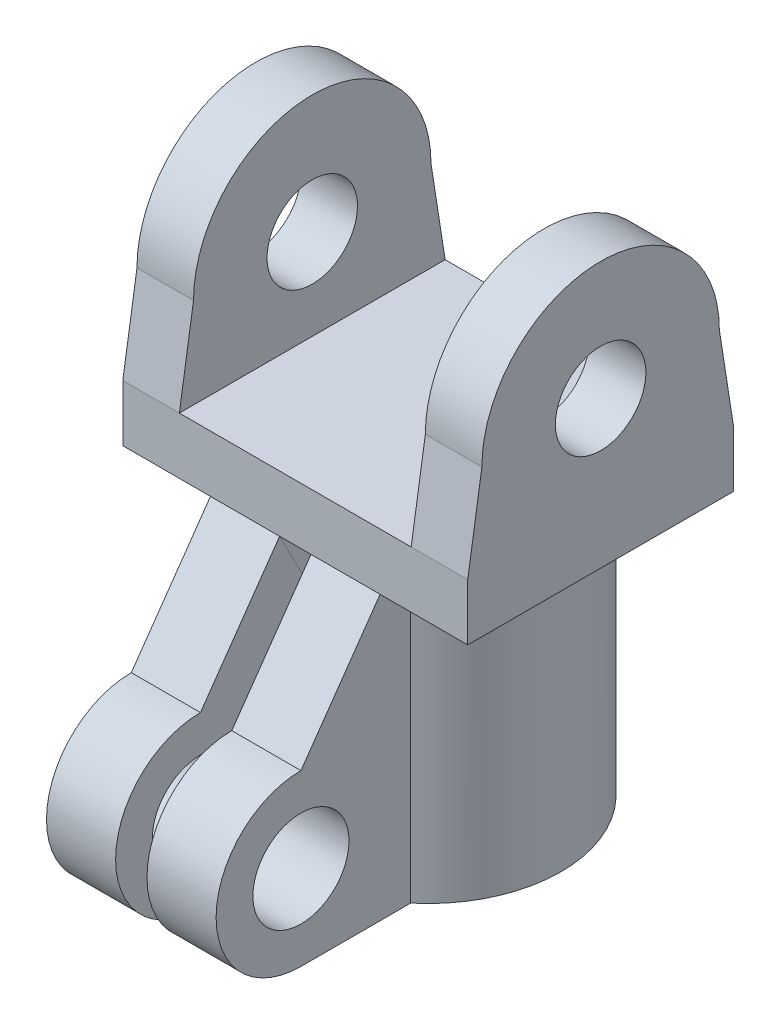
ISO-10303-21;
HEADER;
FILE_DESCRIPTION(('STEP AP214'),'2;1');
FILE_NAME('part.step','',(''),(''),'','','');
FILE_SCHEMA(('AUTOMOTIVE_DESIGN { 1 0 10303 214 1 1 1 1 }'));
ENDSEC;
DATA;
#1=APPLICATION_CONTEXT('core data for automotive mechanical design processes');
#2=APPLICATION_PROTOCOL_DEFINITION('international standard','automotive_design',2000,#1);
#3=PRODUCT_CONTEXT('',#1,'mechanical');
#4=PRODUCT('Part','Part','',(#3));
#5=PRODUCT_RELATED_PRODUCT_CATEGORY('part','',(#4));
#6=PRODUCT_DEFINITION_FORMATION('','',#4);
#7=PRODUCT_DEFINITION_CONTEXT('part definition',#1,'design');
#8=PRODUCT_DEFINITION('design','',#6,#7);
#9=PRODUCT_DEFINITION_SHAPE('','',#8);
#10=(LENGTH_UNIT() NAMED_UNIT(*) SI_UNIT(.MILLI.,.METRE.));
#11=(NAMED_UNIT(*) PLANE_ANGLE_UNIT() SI_UNIT($,.RADIAN.));
#12=(NAMED_UNIT(*) SI_UNIT($,.STERADIAN.) SOLID_ANGLE_UNIT());
#13=UNCERTAINTY_MEASURE_WITH_UNIT(LENGTH_MEASURE(1.E-05),#10,'distance_accuracy_value','');
#14=(GEOMETRIC_REPRESENTATION_CONTEXT(3) GLOBAL_UNCERTAINTY_ASSIGNED_CONTEXT((#13)) GLOBAL_UNIT_ASSIGNED_CONTEXT((#10,
#11,#12)) REPRESENTATION_CONTEXT('',''));
#15=CARTESIAN_POINT('',(0.,0.,0.));
#16=DIRECTION('',(0.,0.,1.));
#17=DIRECTION('',(1.,0.,0.));
#18=AXIS2_PLACEMENT_3D('',#15,#16,#17);
#19=CARTESIAN_POINT('',(-3.,3.,7.5));
#20=DIRECTION('',(1.,0.,0.));
#21=DIRECTION('',(0.,0.,-1.));
#22=AXIS2_PLACEMENT_3D('',#19,#20,#21);
#23=CYLINDRICAL_SURFACE('',#22,3.);
#24=DIRECTION('',(1.,0.,0.));
#25=VECTOR('',#24,1.);
#26=CARTESIAN_POINT('',(-3.,0.,7.5));
#27=LINE('',#26,#25);
#28=CARTESIAN_POINT('',(-3.,0.,7.5));
#29=VERTEX_POINT('',#28);
#30=CARTESIAN_POINT('',(-0.554698457996553,0.,7.5));
#31=VERTEX_POINT('',#30);
#32=EDGE_CURVE('E143',#29,#31,#27,.T.);
#33=ORIENTED_EDGE('',*,*,#32,.T.);
#34=CARTESIAN_POINT('',(-0.554698457996553,3.,7.5));
#35=DIRECTION('',(1.,0.,0.));
#36=DIRECTION('',(0.,0.,-1.));
#37=AXIS2_PLACEMENT_3D('',#34,#35,#36);
#38=CIRCLE('',#37,3.);
#39=CARTESIAN_POINT('',(-0.554698457996553,6.,7.5));
#40=VERTEX_POINT('',#39);
#41=EDGE_CURVE('E69',#31,#40,#38,.F.);
#42=ORIENTED_EDGE('',*,*,#41,.T.);
#43=DIRECTION('',(1.,0.,0.));
#44=VECTOR('',#43,1.);
#45=CARTESIAN_POINT('',(-3.,6.,7.5));
#46=LINE('',#45,#44);
#47=CARTESIAN_POINT('',(-3.,6.,7.5));
#48=VERTEX_POINT('',#47);
#49=EDGE_CURVE('E126',#48,#40,#46,.T.);
#50=ORIENTED_EDGE('',*,*,#49,.F.);
#51=CARTESIAN_POINT('',(-3.,3.,7.5));
#52=DIRECTION('',(1.,0.,0.));
#53=DIRECTION('',(0.,0.,-1.));
#54=AXIS2_PLACEMENT_3D('',#51,#52,#53);
#55=CIRCLE('',#54,3.);
#56=EDGE_CURVE('E166',#48,#29,#55,.T.);
#57=ORIENTED_EDGE('',*,*,#56,.T.);
#58=EDGE_LOOP('',(#33,#42,#50,#57));
#59=FACE_BOUND('',#58,.T.);
#60=ADVANCED_FACE('F50',(#59),#23,.T.);
#61=CARTESIAN_POINT('',(-3.,6.,7.5));
#62=DIRECTION('',(0.,0.573462344363329,0.81923192051904));
#63=DIRECTION('',(0.,-0.81923192051904,0.573462344363329));
#64=AXIS2_PLACEMENT_3D('',#61,#62,#63);
#65=PLANE('',#64);
#66=ORIENTED_EDGE('',*,*,#49,.T.);
#67=DIRECTION('',(0.,0.81923192051904,-0.573462344363329));
#68=VECTOR('',#67,1.);
#69=CARTESIAN_POINT('',(-0.554698457996553,6.,7.5));
#70=LINE('',#69,#68);
#71=CARTESIAN_POINT('',(-0.554698457996553,10.,4.7));
#72=VERTEX_POINT('',#71);
#73=EDGE_CURVE('E113',#40,#72,#70,.T.);
#74=ORIENTED_EDGE('',*,*,#73,.T.);
#75=DIRECTION('',(1.,0.,0.));
#76=VECTOR('',#75,1.);
#77=CARTESIAN_POINT('',(-3.,10.,4.7));
#78=LINE('',#77,#76);
#79=CARTESIAN_POINT('',(-3.,10.,4.7));
#80=VERTEX_POINT('',#79);
#81=EDGE_CURVE('E120',#80,#72,#78,.T.);
#82=ORIENTED_EDGE('',*,*,#81,.F.);
#83=DIRECTION('',(0.,-0.81923192051904,0.573462344363329));
#84=VECTOR('',#83,1.);
#85=CARTESIAN_POINT('',(-3.,6.,7.5));
#86=LINE('',#85,#84);
#87=EDGE_CURVE('E127',#80,#48,#86,.T.);
#88=ORIENTED_EDGE('',*,*,#87,.T.);
#89=EDGE_LOOP('',(#66,#74,#82,#88));
#90=FACE_BOUND('',#89,.T.);
#91=ADVANCED_FACE('F123',(#90),#65,.T.);
#92=CARTESIAN_POINT('',(-3.,10.,4.7));
#93=DIRECTION('',(0.,1.,0.));
#94=DIRECTION('',(0.,0.,1.));
#95=AXIS2_PLACEMENT_3D('',#92,#93,#94);
#96=PLANE('',#95);
#97=ORIENTED_EDGE('',*,*,#81,.T.);
#98=DIRECTION('',(0.,0.,-1.));
#99=VECTOR('',#98,1.);
#100=CARTESIAN_POINT('',(-0.554698457996553,10.,10.5));
#101=LINE('',#100,#99);
#102=CARTESIAN_POINT('',(-0.554698457996553,10.,0.));
#103=VERTEX_POINT('',#102);
#104=EDGE_CURVE('E109',#72,#103,#101,.T.);
#105=ORIENTED_EDGE('',*,*,#104,.T.);
#106=DIRECTION('',(1.,0.,0.));
#107=VECTOR('',#106,1.);
#108=CARTESIAN_POINT('',(-3.,10.,0.));
#109=LINE('',#108,#107);
#110=CARTESIAN_POINT('',(-3.,10.,0.));
#111=VERTEX_POINT('',#110);
#112=EDGE_CURVE('E137',#111,#103,#109,.T.);
#113=ORIENTED_EDGE('',*,*,#112,.F.);
#114=DIRECTION('',(0.,0.,1.));
#115=VECTOR('',#114,1.);
#116=CARTESIAN_POINT('',(-3.,10.,4.7));
#117=LINE('',#116,#115);
#118=EDGE_CURVE('E119',#111,#80,#117,.T.);
#119=ORIENTED_EDGE('',*,*,#118,.T.);
#120=EDGE_LOOP('',(#97,#105,#113,#119));
#121=FACE_BOUND('',#120,.T.);
#122=ADVANCED_FACE('F129',(#121),#96,.T.);
#123=CARTESIAN_POINT('',(-3.,10.,0.));
#124=DIRECTION('',(0.,0.,-1.));
#125=DIRECTION('',(-1.,0.,0.));
#126=AXIS2_PLACEMENT_3D('',#123,#124,#125);
#127=PLANE('',#126);
#128=ORIENTED_EDGE('',*,*,#112,.T.);
#129=DIRECTION('',(0.,-1.,0.));
#130=VECTOR('',#129,1.);
#131=CARTESIAN_POINT('',(-0.554698457996553,10.,0.));
#132=LINE('',#131,#130);
#133=CARTESIAN_POINT('',(-0.554698457996553,6.,0.));
#134=VERTEX_POINT('',#133);
#135=EDGE_CURVE('E115',#103,#134,#132,.T.);
#136=ORIENTED_EDGE('',*,*,#135,.T.);
#137=DIRECTION('',(-1.,0.,0.));
#138=VECTOR('',#137,1.);
#139=CARTESIAN_POINT('',(-3.,6.,0.));
#140=LINE('',#139,#138);
#141=CARTESIAN_POINT('',(-2.7,6.,0.));
#142=VERTEX_POINT('',#141);
#143=EDGE_CURVE('E163',#134,#142,#140,.T.);
#144=ORIENTED_EDGE('',*,*,#143,.T.);
#145=DIRECTION('',(0.,-1.,0.));
#146=VECTOR('',#145,1.);
#147=CARTESIAN_POINT('',(-2.7,6.,0.));
#148=LINE('',#147,#146);
#149=CARTESIAN_POINT('',(-2.7,0.,0.));
#150=VERTEX_POINT('',#149);
#151=EDGE_CURVE('E155',#150,#142,#148,.F.);
#152=ORIENTED_EDGE('',*,*,#151,.F.);
#153=DIRECTION('',(1.,0.,0.));
#154=VECTOR('',#153,1.);
#155=CARTESIAN_POINT('',(-3.,0.,0.));
#156=LINE('',#155,#154);
#157=CARTESIAN_POINT('',(-3.,0.,0.));
#158=VERTEX_POINT('',#157);
#159=EDGE_CURVE('E139',#158,#150,#156,.T.);
#160=ORIENTED_EDGE('',*,*,#159,.F.);
#161=DIRECTION('',(0.,1.,0.));
#162=VECTOR('',#161,1.);
#163=CARTESIAN_POINT('',(-3.,10.,0.));
#164=LINE('',#163,#162);
#165=EDGE_CURVE('E160',#158,#111,#164,.T.);
#166=ORIENTED_EDGE('',*,*,#165,.T.);
#167=EDGE_LOOP('',(#128,#136,#144,#152,#160,#166));
#168=FACE_BOUND('',#167,.T.);
#169=ADVANCED_FACE('F174',(#168),#127,.T.);
#170=CARTESIAN_POINT('',(-3.,0.,0.));
#171=DIRECTION('',(0.,-1.,0.));
#172=DIRECTION('',(0.,0.,-1.));
#173=AXIS2_PLACEMENT_3D('',#170,#171,#172);
#174=PLANE('',#173);
#175=CARTESIAN_POINT('',(0.,0.,0.));
#176=DIRECTION('',(0.,-1.,0.));
#177=DIRECTION('',(0.,0.,-1.));
#178=AXIS2_PLACEMENT_3D('',#175,#176,#177);
#179=CIRCLE('',#178,2.7);
#180=CARTESIAN_POINT('',(-0.554698457996553,0.,2.64240602873522));
#181=VERTEX_POINT('',#180);
#182=EDGE_CURVE('E54',#181,#150,#179,.T.);
#183=ORIENTED_EDGE('',*,*,#182,.F.);
#184=DIRECTION('',(0.,0.,-1.));
#185=VECTOR('',#184,1.);
#186=CARTESIAN_POINT('',(-0.554698457996553,0.,10.5));
#187=LINE('',#186,#185);
#188=EDGE_CURVE('E153',#31,#181,#187,.T.);
#189=ORIENTED_EDGE('',*,*,#188,.F.);
#190=ORIENTED_EDGE('',*,*,#32,.F.);
#191=DIRECTION('',(0.,0.,-1.));
#192=VECTOR('',#191,1.);
#193=CARTESIAN_POINT('',(-3.,0.,0.));
#194=LINE('',#193,#192);
#195=EDGE_CURVE('E142',#29,#158,#194,.T.);
#196=ORIENTED_EDGE('',*,*,#195,.T.);
#197=ORIENTED_EDGE('',*,*,#159,.T.);
#198=EDGE_LOOP('',(#183,#189,#190,#196,#197));
#199=FACE_BOUND('',#198,.T.);
#200=ADVANCED_FACE('F200',(#199),#174,.T.);
#201=CARTESIAN_POINT('',(-3.,3.,7.5));
#202=DIRECTION('',(1.,0.,0.));
#203=DIRECTION('',(0.,0.,-1.));
#204=AXIS2_PLACEMENT_3D('',#201,#202,#203);
#205=CYLINDRICAL_SURFACE('',#204,1.7);
#206=CARTESIAN_POINT('',(-3.,3.,7.5));
#207=DIRECTION('',(1.,0.,0.));
#208=DIRECTION('',(0.,0.,-1.));
#209=AXIS2_PLACEMENT_3D('',#206,#207,#208);
#210=CIRCLE('',#209,1.7);
#211=CARTESIAN_POINT('',(-3.,3.,5.8));
#212=VERTEX_POINT('',#211);
#213=EDGE_CURVE('E147',#212,#212,#210,.T.);
#214=ORIENTED_EDGE('',*,*,#213,.F.);
#215=EDGE_LOOP('',(#214));
#216=FACE_BOUND('',#215,.T.);
#217=CARTESIAN_POINT('',(-0.554698457996553,3.,7.5));
#218=DIRECTION('',(1.,0.,0.));
#219=DIRECTION('',(0.,0.,-1.));
#220=AXIS2_PLACEMENT_3D('',#217,#218,#219);
#221=CIRCLE('',#220,1.7);
#222=CARTESIAN_POINT('',(-0.554698457996553,3.,5.8));
#223=VERTEX_POINT('',#222);
#224=EDGE_CURVE('E12',#223,#223,#221,.F.);
#225=ORIENTED_EDGE('',*,*,#224,.F.);
#226=EDGE_LOOP('',(#225));
#227=FACE_BOUND('',#226,.T.);
#228=ADVANCED_FACE('F52',(#216,#227),#205,.F.);
#229=CARTESIAN_POINT('',(0.,6.,0.));
#230=DIRECTION('',(0.,-1.,0.));
#231=DIRECTION('',(0.,0.,-1.));
#232=AXIS2_PLACEMENT_3D('',#229,#230,#231);
#233=CYLINDRICAL_SURFACE('',#232,2.7);
#234=DIRECTION('',(0.,-1.,0.));
#235=VECTOR('',#234,1.);
#236=CARTESIAN_POINT('',(-0.554698457996553,6.,2.64240602873522));
#237=LINE('',#236,#235);
#238=CARTESIAN_POINT('',(-0.554698457996553,6.,2.64240602873522));
#239=VERTEX_POINT('',#238);
#240=EDGE_CURVE('E60',#181,#239,#237,.F.);
#241=ORIENTED_EDGE('',*,*,#240,.F.);
#242=ORIENTED_EDGE('',*,*,#182,.T.);
#243=ORIENTED_EDGE('',*,*,#151,.T.);
#244=CARTESIAN_POINT('',(0.,6.,0.));
#245=DIRECTION('',(0.,-1.,0.));
#246=DIRECTION('',(0.,0.,-1.));
#247=AXIS2_PLACEMENT_3D('',#244,#245,#246);
#248=CIRCLE('',#247,2.7);
#249=EDGE_CURVE('E145',#239,#142,#248,.T.);
#250=ORIENTED_EDGE('',*,*,#249,.F.);
#251=EDGE_LOOP('',(#241,#242,#243,#250));
#252=FACE_BOUND('',#251,.T.);
#253=ADVANCED_FACE('F178',(#252),#233,.F.);
#254=CARTESIAN_POINT('',(0.,6.,0.));
#255=DIRECTION('',(0.,-1.,0.));
#256=DIRECTION('',(0.,0.,-1.));
#257=AXIS2_PLACEMENT_3D('',#254,#255,#256);
#258=PLANE('',#257);
#259=ORIENTED_EDGE('',*,*,#143,.F.);
#260=DIRECTION('',(0.,0.,1.));
#261=VECTOR('',#260,1.);
#262=CARTESIAN_POINT('',(-0.554698457996553,6.,0.));
#263=LINE('',#262,#261);
#264=EDGE_CURVE('E82',#134,#239,#263,.T.);
#265=ORIENTED_EDGE('',*,*,#264,.T.);
#266=ORIENTED_EDGE('',*,*,#249,.T.);
#267=EDGE_LOOP('',(#259,#265,#266));
#268=FACE_BOUND('',#267,.T.);
#269=ADVANCED_FACE('F175',(#268),#258,.T.);
#270=CARTESIAN_POINT('',(-3.,3.,7.5));
#271=DIRECTION('',(1.,0.,0.));
#272=DIRECTION('',(0.,0.,-1.));
#273=AXIS2_PLACEMENT_3D('',#270,#271,#272);
#274=PLANE('',#273);
#275=ORIENTED_EDGE('',*,*,#213,.T.);
#276=EDGE_LOOP('',(#275));
#277=FACE_BOUND('',#276,.T.);
#278=ORIENTED_EDGE('',*,*,#56,.F.);
#279=ORIENTED_EDGE('',*,*,#87,.F.);
#280=ORIENTED_EDGE('',*,*,#118,.F.);
#281=ORIENTED_EDGE('',*,*,#165,.F.);
#282=ORIENTED_EDGE('',*,*,#195,.F.);
#283=EDGE_LOOP('',(#278,#279,#280,#281,#282));
#284=FACE_BOUND('',#283,.T.);
#285=ADVANCED_FACE('F177',(#277,#284),#274,.F.);
#286=CARTESIAN_POINT('',(-0.554698457996553,10.,10.5));
#287=DIRECTION('',(1.,0.,0.));
#288=DIRECTION('',(0.,0.,-1.));
#289=AXIS2_PLACEMENT_3D('',#286,#287,#288);
#290=PLANE('',#289);
#291=ORIENTED_EDGE('',*,*,#188,.T.);
#292=ORIENTED_EDGE('',*,*,#240,.T.);
#293=ORIENTED_EDGE('',*,*,#264,.F.);
#294=ORIENTED_EDGE('',*,*,#135,.F.);
#295=ORIENTED_EDGE('',*,*,#104,.F.);
#296=ORIENTED_EDGE('',*,*,#73,.F.);
#297=ORIENTED_EDGE('',*,*,#41,.F.);
#298=EDGE_LOOP('',(#291,#292,#293,#294,#295,#296,#297));
#299=FACE_BOUND('',#298,.T.);
#300=ORIENTED_EDGE('',*,*,#224,.T.);
#301=EDGE_LOOP('',(#300));
#302=FACE_BOUND('',#301,.T.);
#303=ADVANCED_FACE('F111',(#299,#302),#290,.T.);
#304=CLOSED_SHELL('',(#60,#91,#122,#169,#200,#228,#253,#269,#285,#303));
#305=MANIFOLD_SOLID_BREP('B2',#304);
#306=CARTESIAN_POINT('',(0.,6.,0.));
#307=DIRECTION('',(0.,-1.,0.));
#308=DIRECTION('',(0.,0.,-1.));
#309=AXIS2_PLACEMENT_3D('',#306,#307,#308);
#310=PLANE('',#309);
#311=CARTESIAN_POINT('',(0.,6.,0.));
#312=DIRECTION('',(0.,-1.,0.));
#313=DIRECTION('',(0.,0.,-1.));
#314=AXIS2_PLACEMENT_3D('',#311,#312,#313);
#315=CIRCLE('',#314,2.7);
#316=CARTESIAN_POINT('',(2.7,6.,0.));
#317=VERTEX_POINT('',#316);
#318=CARTESIAN_POINT('',(0.554698457996553,6.,2.64240602873522));
#319=VERTEX_POINT('',#318);
#320=EDGE_CURVE('E390',#317,#319,#315,.T.);
#321=ORIENTED_EDGE('',*,*,#320,.T.);
#322=DIRECTION('',(0.,0.,-1.));
#323=VECTOR('',#322,1.);
#324=CARTESIAN_POINT('',(0.554698457996553,6.,0.));
#325=LINE('',#324,#323);
#326=CARTESIAN_POINT('',(0.554698457996553,6.,0.));
#327=VERTEX_POINT('',#326);
#328=EDGE_CURVE('E48',#319,#327,#325,.T.);
#329=ORIENTED_EDGE('',*,*,#328,.T.);
#330=DIRECTION('',(-1.,0.,0.));
#331=VECTOR('',#330,1.);
#332=CARTESIAN_POINT('',(-3.,6.,0.));
#333=LINE('',#332,#331);
#334=EDGE_CURVE('E290',#317,#327,#333,.T.);
#335=ORIENTED_EDGE('',*,*,#334,.F.);
#336=EDGE_LOOP('',(#321,#329,#335));
#337=FACE_BOUND('',#336,.T.);
#338=ADVANCED_FACE('F282',(#337),#310,.T.);
#339=CARTESIAN_POINT('',(0.,6.,0.));
#340=DIRECTION('',(0.,-1.,0.));
#341=DIRECTION('',(0.,0.,-1.));
#342=AXIS2_PLACEMENT_3D('',#339,#340,#341);
#343=CYLINDRICAL_SURFACE('',#342,2.7);
#344=DIRECTION('',(0.,-1.,0.));
#345=VECTOR('',#344,1.);
#346=CARTESIAN_POINT('',(0.554698457996553,6.,2.64240602873522));
#347=LINE('',#346,#345);
#348=CARTESIAN_POINT('',(0.554698457996553,0.,2.64240602873522));
#349=VERTEX_POINT('',#348);
#350=EDGE_CURVE('E401',#319,#349,#347,.T.);
#351=ORIENTED_EDGE('',*,*,#350,.F.);
#352=ORIENTED_EDGE('',*,*,#320,.F.);
#353=DIRECTION('',(0.,-1.,0.));
#354=VECTOR('',#353,1.);
#355=CARTESIAN_POINT('',(2.7,6.,0.));
#356=LINE('',#355,#354);
#357=CARTESIAN_POINT('',(2.7,0.,0.));
#358=VERTEX_POINT('',#357);
#359=EDGE_CURVE('E304',#317,#358,#356,.T.);
#360=ORIENTED_EDGE('',*,*,#359,.T.);
#361=CARTESIAN_POINT('',(0.,0.,0.));
#362=DIRECTION('',(0.,-1.,0.));
#363=DIRECTION('',(0.,0.,-1.));
#364=AXIS2_PLACEMENT_3D('',#361,#362,#363);
#365=CIRCLE('',#364,2.7);
#366=EDGE_CURVE('E391',#358,#349,#365,.T.);
#367=ORIENTED_EDGE('',*,*,#366,.T.);
#368=EDGE_LOOP('',(#351,#352,#360,#367));
#369=FACE_BOUND('',#368,.T.);
#370=ADVANCED_FACE('F411',(#369),#343,.F.);
#371=CARTESIAN_POINT('',(-3.,0.,0.));
#372=DIRECTION('',(0.,-1.,0.));
#373=DIRECTION('',(0.,0.,-1.));
#374=AXIS2_PLACEMENT_3D('',#371,#372,#373);
#375=PLANE('',#374);
#376=DIRECTION('',(1.,0.,0.));
#377=VECTOR('',#376,1.);
#378=CARTESIAN_POINT('',(-3.,0.,7.5));
#379=LINE('',#378,#377);
#380=CARTESIAN_POINT('',(0.554698457996553,0.,7.5));
#381=VERTEX_POINT('',#380);
#382=CARTESIAN_POINT('',(3.,0.,7.5));
#383=VERTEX_POINT('',#382);
#384=EDGE_CURVE('E366',#381,#383,#379,.T.);
#385=ORIENTED_EDGE('',*,*,#384,.F.);
#386=DIRECTION('',(0.,0.,-1.));
#387=VECTOR('',#386,1.);
#388=CARTESIAN_POINT('',(0.554698457996553,0.,10.5));
#389=LINE('',#388,#387);
#390=EDGE_CURVE('E348',#381,#349,#389,.T.);
#391=ORIENTED_EDGE('',*,*,#390,.T.);
#392=ORIENTED_EDGE('',*,*,#366,.F.);
#393=DIRECTION('',(1.,0.,0.));
#394=VECTOR('',#393,1.);
#395=CARTESIAN_POINT('',(-3.,0.,0.));
#396=LINE('',#395,#394);
#397=CARTESIAN_POINT('',(3.,0.,0.));
#398=VERTEX_POINT('',#397);
#399=EDGE_CURVE('E362',#358,#398,#396,.T.);
#400=ORIENTED_EDGE('',*,*,#399,.T.);
#401=DIRECTION('',(0.,0.,-1.));
#402=VECTOR('',#401,1.);
#403=CARTESIAN_POINT('',(3.,0.,0.));
#404=LINE('',#403,#402);
#405=EDGE_CURVE('E380',#383,#398,#404,.T.);
#406=ORIENTED_EDGE('',*,*,#405,.F.);
#407=EDGE_LOOP('',(#385,#391,#392,#400,#406));
#408=FACE_BOUND('',#407,.T.);
#409=ADVANCED_FACE('F407',(#408),#375,.T.);
#410=CARTESIAN_POINT('',(-3.,10.,0.));
#411=DIRECTION('',(0.,0.,-1.));
#412=DIRECTION('',(-1.,0.,0.));
#413=AXIS2_PLACEMENT_3D('',#410,#411,#412);
#414=PLANE('',#413);
#415=ORIENTED_EDGE('',*,*,#334,.T.);
#416=DIRECTION('',(0.,1.,0.));
#417=VECTOR('',#416,1.);
#418=CARTESIAN_POINT('',(0.554698457996553,10.,0.));
#419=LINE('',#418,#417);
#420=CARTESIAN_POINT('',(0.554698457996553,10.,0.));
#421=VERTEX_POINT('',#420);
#422=EDGE_CURVE('E297',#327,#421,#419,.T.);
#423=ORIENTED_EDGE('',*,*,#422,.T.);
#424=DIRECTION('',(1.,0.,0.));
#425=VECTOR('',#424,1.);
#426=CARTESIAN_POINT('',(-3.,10.,0.));
#427=LINE('',#426,#425);
#428=CARTESIAN_POINT('',(3.,10.,0.));
#429=VERTEX_POINT('',#428);
#430=EDGE_CURVE('E354',#421,#429,#427,.T.);
#431=ORIENTED_EDGE('',*,*,#430,.T.);
#432=DIRECTION('',(0.,1.,0.));
#433=VECTOR('',#432,1.);
#434=CARTESIAN_POINT('',(3.,10.,0.));
#435=LINE('',#434,#433);
#436=EDGE_CURVE('E378',#398,#429,#435,.T.);
#437=ORIENTED_EDGE('',*,*,#436,.F.);
#438=ORIENTED_EDGE('',*,*,#399,.F.);
#439=ORIENTED_EDGE('',*,*,#359,.F.);
#440=EDGE_LOOP('',(#415,#423,#431,#437,#438,#439));
#441=FACE_BOUND('',#440,.T.);
#442=ADVANCED_FACE('F352',(#441),#414,.T.);
#443=CARTESIAN_POINT('',(-3.,10.,4.7));
#444=DIRECTION('',(0.,1.,0.));
#445=DIRECTION('',(0.,0.,1.));
#446=AXIS2_PLACEMENT_3D('',#443,#444,#445);
#447=PLANE('',#446);
#448=ORIENTED_EDGE('',*,*,#430,.F.);
#449=DIRECTION('',(0.,0.,-1.));
#450=VECTOR('',#449,1.);
#451=CARTESIAN_POINT('',(0.554698457996553,10.,10.5));
#452=LINE('',#451,#450);
#453=CARTESIAN_POINT('',(0.554698457996553,10.,4.7));
#454=VERTEX_POINT('',#453);
#455=EDGE_CURVE('E340',#454,#421,#452,.T.);
#456=ORIENTED_EDGE('',*,*,#455,.F.);
#457=DIRECTION('',(1.,0.,0.));
#458=VECTOR('',#457,1.);
#459=CARTESIAN_POINT('',(-3.,10.,4.7));
#460=LINE('',#459,#458);
#461=CARTESIAN_POINT('',(3.,10.,4.7));
#462=VERTEX_POINT('',#461);
#463=EDGE_CURVE('E361',#454,#462,#460,.T.);
#464=ORIENTED_EDGE('',*,*,#463,.T.);
#465=DIRECTION('',(0.,0.,1.));
#466=VECTOR('',#465,1.);
#467=CARTESIAN_POINT('',(3.,10.,4.7));
#468=LINE('',#467,#466);
#469=EDGE_CURVE('E360',#429,#462,#468,.T.);
#470=ORIENTED_EDGE('',*,*,#469,.F.);
#471=EDGE_LOOP('',(#448,#456,#464,#470));
#472=FACE_BOUND('',#471,.T.);
#473=ADVANCED_FACE('F358',(#472),#447,.T.);
#474=CARTESIAN_POINT('',(-3.,6.,7.5));
#475=DIRECTION('',(0.,0.573462344363329,0.81923192051904));
#476=DIRECTION('',(0.,-0.81923192051904,0.573462344363329));
#477=AXIS2_PLACEMENT_3D('',#474,#475,#476);
#478=PLANE('',#477);
#479=ORIENTED_EDGE('',*,*,#463,.F.);
#480=DIRECTION('',(0.,-0.81923192051904,0.573462344363329));
#481=VECTOR('',#480,1.);
#482=CARTESIAN_POINT('',(0.554698457996553,6.,7.5));
#483=LINE('',#482,#481);
#484=CARTESIAN_POINT('',(0.554698457996553,6.,7.5));
#485=VERTEX_POINT('',#484);
#486=EDGE_CURVE('E344',#454,#485,#483,.T.);
#487=ORIENTED_EDGE('',*,*,#486,.T.);
#488=DIRECTION('',(1.,0.,0.));
#489=VECTOR('',#488,1.);
#490=CARTESIAN_POINT('',(-3.,6.,7.5));
#491=LINE('',#490,#489);
#492=CARTESIAN_POINT('',(3.,6.,7.5));
#493=VERTEX_POINT('',#492);
#494=EDGE_CURVE('E364',#485,#493,#491,.T.);
#495=ORIENTED_EDGE('',*,*,#494,.T.);
#496=DIRECTION('',(0.,-0.81923192051904,0.573462344363329));
#497=VECTOR('',#496,1.);
#498=CARTESIAN_POINT('',(3.,6.,7.5));
#499=LINE('',#498,#497);
#500=EDGE_CURVE('E370',#462,#493,#499,.T.);
#501=ORIENTED_EDGE('',*,*,#500,.F.);
#502=EDGE_LOOP('',(#479,#487,#495,#501));
#503=FACE_BOUND('',#502,.T.);
#504=ADVANCED_FACE('F429',(#503),#478,.T.);
#505=CARTESIAN_POINT('',(-3.,3.,7.5));
#506=DIRECTION('',(1.,0.,0.));
#507=DIRECTION('',(0.,0.,-1.));
#508=AXIS2_PLACEMENT_3D('',#505,#506,#507);
#509=CYLINDRICAL_SURFACE('',#508,3.);
#510=CARTESIAN_POINT('',(0.554698457996553,3.,7.5));
#511=DIRECTION('',(-1.,0.,0.));
#512=DIRECTION('',(0.,0.,1.));
#513=AXIS2_PLACEMENT_3D('',#510,#511,#512);
#514=CIRCLE('',#513,3.);
#515=EDGE_CURVE('E393',#485,#381,#514,.F.);
#516=ORIENTED_EDGE('',*,*,#515,.T.);
#517=ORIENTED_EDGE('',*,*,#384,.T.);
#518=CARTESIAN_POINT('',(3.,3.,7.5));
#519=DIRECTION('',(1.,0.,0.));
#520=DIRECTION('',(0.,0.,-1.));
#521=AXIS2_PLACEMENT_3D('',#518,#519,#520);
#522=CIRCLE('',#521,3.);
#523=EDGE_CURVE('E383',#493,#383,#522,.T.);
#524=ORIENTED_EDGE('',*,*,#523,.F.);
#525=ORIENTED_EDGE('',*,*,#494,.F.);
#526=EDGE_LOOP('',(#516,#517,#524,#525));
#527=FACE_BOUND('',#526,.T.);
#528=ADVANCED_FACE('F284',(#527),#509,.T.);
#529=CARTESIAN_POINT('',(3.,3.,7.5));
#530=DIRECTION('',(1.,0.,0.));
#531=DIRECTION('',(0.,0.,-1.));
#532=AXIS2_PLACEMENT_3D('',#529,#530,#531);
#533=PLANE('',#532);
#534=ORIENTED_EDGE('',*,*,#523,.T.);
#535=ORIENTED_EDGE('',*,*,#405,.T.);
#536=ORIENTED_EDGE('',*,*,#436,.T.);
#537=ORIENTED_EDGE('',*,*,#469,.T.);
#538=ORIENTED_EDGE('',*,*,#500,.T.);
#539=EDGE_LOOP('',(#534,#535,#536,#537,#538));
#540=FACE_BOUND('',#539,.T.);
#541=CARTESIAN_POINT('',(3.,3.,7.5));
#542=DIRECTION('',(1.,0.,0.));
#543=DIRECTION('',(0.,0.,-1.));
#544=AXIS2_PLACEMENT_3D('',#541,#542,#543);
#545=CIRCLE('',#544,1.7);
#546=CARTESIAN_POINT('',(3.,3.,5.8));
#547=VERTEX_POINT('',#546);
#548=EDGE_CURVE('E386',#547,#547,#545,.T.);
#549=ORIENTED_EDGE('',*,*,#548,.F.);
#550=EDGE_LOOP('',(#549));
#551=FACE_BOUND('',#550,.T.);
#552=ADVANCED_FACE('F421',(#540,#551),#533,.T.);
#553=CARTESIAN_POINT('',(-3.,3.,7.5));
#554=DIRECTION('',(1.,0.,0.));
#555=DIRECTION('',(0.,0.,-1.));
#556=AXIS2_PLACEMENT_3D('',#553,#554,#555);
#557=CYLINDRICAL_SURFACE('',#556,1.7);
#558=ORIENTED_EDGE('',*,*,#548,.T.);
#559=EDGE_LOOP('',(#558));
#560=FACE_BOUND('',#559,.T.);
#561=CARTESIAN_POINT('',(0.554698457996553,3.,7.5));
#562=DIRECTION('',(-1.,0.,0.));
#563=DIRECTION('',(0.,0.,1.));
#564=AXIS2_PLACEMENT_3D('',#561,#562,#563);
#565=CIRCLE('',#564,1.7);
#566=CARTESIAN_POINT('',(0.554698457996553,3.,9.2));
#567=VERTEX_POINT('',#566);
#568=EDGE_CURVE('E398',#567,#567,#565,.F.);
#569=ORIENTED_EDGE('',*,*,#568,.F.);
#570=EDGE_LOOP('',(#569));
#571=FACE_BOUND('',#570,.T.);
#572=ADVANCED_FACE('F424',(#560,#571),#557,.F.);
#573=CARTESIAN_POINT('',(0.554698457996553,10.,10.5));
#574=DIRECTION('',(-1.,0.,0.));
#575=DIRECTION('',(0.,0.,1.));
#576=AXIS2_PLACEMENT_3D('',#573,#574,#575);
#577=PLANE('',#576);
#578=ORIENTED_EDGE('',*,*,#515,.F.);
#579=ORIENTED_EDGE('',*,*,#486,.F.);
#580=ORIENTED_EDGE('',*,*,#455,.T.);
#581=ORIENTED_EDGE('',*,*,#422,.F.);
#582=ORIENTED_EDGE('',*,*,#328,.F.);
#583=ORIENTED_EDGE('',*,*,#350,.T.);
#584=ORIENTED_EDGE('',*,*,#390,.F.);
#585=EDGE_LOOP('',(#578,#579,#580,#581,#582,#583,#584));
#586=FACE_BOUND('',#585,.T.);
#587=ORIENTED_EDGE('',*,*,#568,.T.);
#588=EDGE_LOOP('',(#587));
#589=FACE_BOUND('',#588,.T.);
#590=ADVANCED_FACE('F341',(#586,#589),#577,.T.);
#591=CLOSED_SHELL('',(#338,#370,#409,#442,#473,#504,#528,#552,#572,#590));
#592=MANIFOLD_SOLID_BREP('B6',#591);
#593=CARTESIAN_POINT('',(0.,0.,0.));
#594=DIRECTION('',(0.,1.,0.));
#595=DIRECTION('',(0.,0.,1.));
#596=AXIS2_PLACEMENT_3D('',#593,#594,#595);
#597=PLANE('',#596);
#598=DIRECTION('',(0.,0.,-1.));
#599=VECTOR('',#598,1.);
#600=CARTESIAN_POINT('',(-0.554698457996553,0.,10.5));
#601=LINE('',#600,#599);
#602=CARTESIAN_POINT('',(-0.554698457996553,0.,4.66715219600735));
#603=VERTEX_POINT('',#602);
#604=CARTESIAN_POINT('',(-0.554698457996553,0.,2.64240602873522));
#605=VERTEX_POINT('',#604);
#606=EDGE_CURVE('E612',#603,#605,#601,.T.);
#607=ORIENTED_EDGE('',*,*,#606,.F.);
#608=CARTESIAN_POINT('',(0.,0.,0.));
#609=DIRECTION('',(0.,1.,0.));
#610=DIRECTION('',(0.,0.,1.));
#611=AXIS2_PLACEMENT_3D('',#608,#609,#610);
#612=CIRCLE('',#611,4.7);
#613=CARTESIAN_POINT('',(0.554698457996553,0.,4.66715219600735));
#614=VERTEX_POINT('',#613);
#615=EDGE_CURVE('E509',#614,#603,#612,.T.);
#616=ORIENTED_EDGE('',*,*,#615,.F.);
#617=DIRECTION('',(0.,0.,-1.));
#618=VECTOR('',#617,1.);
#619=CARTESIAN_POINT('',(0.554698457996553,0.,10.5));
#620=LINE('',#619,#618);
#621=CARTESIAN_POINT('',(0.554698457996553,0.,2.64240602873522));
#622=VERTEX_POINT('',#621);
#623=EDGE_CURVE('E629',#614,#622,#620,.T.);
#624=ORIENTED_EDGE('',*,*,#623,.T.);
#625=CARTESIAN_POINT('',(0.,0.,0.));
#626=DIRECTION('',(0.,1.,0.));
#627=DIRECTION('',(0.,0.,1.));
#628=AXIS2_PLACEMENT_3D('',#625,#626,#627);
#629=CIRCLE('',#628,2.7);
#630=EDGE_CURVE('E628',#622,#605,#629,.T.);
#631=ORIENTED_EDGE('',*,*,#630,.T.);
#632=EDGE_LOOP('',(#607,#616,#624,#631));
#633=FACE_BOUND('',#632,.T.);
#634=ADVANCED_FACE('F505',(#633),#597,.F.);
#635=CARTESIAN_POINT('',(0.,10.,0.));
#636=DIRECTION('',(0.,-1.,0.));
#637=DIRECTION('',(0.,0.,-1.));
#638=AXIS2_PLACEMENT_3D('',#635,#636,#637);
#639=CYLINDRICAL_SURFACE('',#638,4.7);
#640=DIRECTION('',(0.,-1.,0.));
#641=VECTOR('',#640,1.);
#642=CARTESIAN_POINT('',(-0.554698457996553,10.,4.66715219600735));
#643=LINE('',#642,#641);
#644=CARTESIAN_POINT('',(-0.554698457996553,10.,4.66715219600735));
#645=VERTEX_POINT('',#644);
#646=EDGE_CURVE('E609',#645,#603,#643,.T.);
#647=ORIENTED_EDGE('',*,*,#646,.F.);
#648=CARTESIAN_POINT('',(0.,10.,0.));
#649=DIRECTION('',(0.,1.,0.));
#650=DIRECTION('',(0.,0.,1.));
#651=AXIS2_PLACEMENT_3D('',#648,#649,#650);
#652=CIRCLE('',#651,4.7);
#653=CARTESIAN_POINT('',(0.,10.,-4.7));
#654=VERTEX_POINT('',#653);
#655=EDGE_CURVE('E514',#654,#645,#652,.T.);
#656=ORIENTED_EDGE('',*,*,#655,.F.);
#657=CARTESIAN_POINT('',(0.554698457996553,10.,4.66715219600735));
#658=VERTEX_POINT('',#657);
#659=EDGE_CURVE('E280',#658,#654,#652,.T.);
#660=ORIENTED_EDGE('',*,*,#659,.F.);
#661=DIRECTION('',(0.,-1.,0.));
#662=VECTOR('',#661,1.);
#663=CARTESIAN_POINT('',(0.554698457996553,10.,4.66715219600735));
#664=LINE('',#663,#662);
#665=EDGE_CURVE('E633',#614,#658,#664,.F.);
#666=ORIENTED_EDGE('',*,*,#665,.F.);
#667=ORIENTED_EDGE('',*,*,#615,.T.);
#668=EDGE_LOOP('',(#647,#656,#660,#666,#667));
#669=FACE_BOUND('',#668,.T.);
#670=ADVANCED_FACE('F507',(#669),#639,.T.);
#671=CARTESIAN_POINT('',(0.,10.,0.));
#672=DIRECTION('',(0.,-1.,0.));
#673=DIRECTION('',(0.,0.,-1.));
#674=AXIS2_PLACEMENT_3D('',#671,#672,#673);
#675=CYLINDRICAL_SURFACE('',#674,2.7);
#676=CARTESIAN_POINT('',(0.,10.,0.));
#677=DIRECTION('',(0.,1.,0.));
#678=DIRECTION('',(0.,0.,1.));
#679=AXIS2_PLACEMENT_3D('',#676,#677,#678);
#680=CIRCLE('',#679,2.7);
#681=CARTESIAN_POINT('',(0.554698457996553,10.,2.64240602873522));
#682=VERTEX_POINT('',#681);
#683=CARTESIAN_POINT('',(-0.554698457996553,10.,2.64240602873522));
#684=VERTEX_POINT('',#683);
#685=EDGE_CURVE('E634',#682,#684,#680,.T.);
#686=ORIENTED_EDGE('',*,*,#685,.T.);
#687=DIRECTION('',(0.,-1.,0.));
#688=VECTOR('',#687,1.);
#689=CARTESIAN_POINT('',(-0.554698457996553,10.,2.64240602873522));
#690=LINE('',#689,#688);
#691=EDGE_CURVE('E621',#684,#605,#690,.T.);
#692=ORIENTED_EDGE('',*,*,#691,.T.);
#693=ORIENTED_EDGE('',*,*,#630,.F.);
#694=DIRECTION('',(0.,-1.,0.));
#695=VECTOR('',#694,1.);
#696=CARTESIAN_POINT('',(0.554698457996553,10.,2.64240602873522));
#697=LINE('',#696,#695);
#698=EDGE_CURVE('E620',#622,#682,#697,.F.);
#699=ORIENTED_EDGE('',*,*,#698,.T.);
#700=EDGE_LOOP('',(#686,#692,#693,#699));
#701=FACE_BOUND('',#700,.T.);
#702=ADVANCED_FACE('F739',(#701),#675,.F.);
#703=CARTESIAN_POINT('',(0.,12.,0.));
#704=DIRECTION('',(0.,-1.,0.));
#705=DIRECTION('',(0.,0.,-1.));
#706=AXIS2_PLACEMENT_3D('',#703,#704,#705);
#707=PLANE('',#706);
#708=DIRECTION('',(0.,0.,1.));
#709=VECTOR('',#708,1.);
#710=CARTESIAN_POINT('',(4.1,12.,-4.7));
#711=LINE('',#710,#709);
#712=CARTESIAN_POINT('',(4.1,12.,-4.7));
#713=VERTEX_POINT('',#712);
#714=CARTESIAN_POINT('',(4.1,12.,4.7));
#715=VERTEX_POINT('',#714);
#716=EDGE_CURVE('E707',#713,#715,#711,.T.);
#717=ORIENTED_EDGE('',*,*,#716,.F.);
#718=DIRECTION('',(-1.,0.,0.));
#719=VECTOR('',#718,1.);
#720=CARTESIAN_POINT('',(-6.1,12.,-4.7));
#721=LINE('',#720,#719);
#722=CARTESIAN_POINT('',(-4.1,12.,-4.7));
#723=VERTEX_POINT('',#722);
#724=EDGE_CURVE('E654',#713,#723,#721,.T.);
#725=ORIENTED_EDGE('',*,*,#724,.T.);
#726=DIRECTION('',(0.,0.,1.));
#727=VECTOR('',#726,1.);
#728=CARTESIAN_POINT('',(-4.1,12.,-4.7));
#729=LINE('',#728,#727);
#730=CARTESIAN_POINT('',(-4.1,12.,4.7));
#731=VERTEX_POINT('',#730);
#732=EDGE_CURVE('E693',#723,#731,#729,.T.);
#733=ORIENTED_EDGE('',*,*,#732,.T.);
#734=DIRECTION('',(1.,0.,0.));
#735=VECTOR('',#734,1.);
#736=CARTESIAN_POINT('',(-6.1,12.,4.7));
#737=LINE('',#736,#735);
#738=EDGE_CURVE('E667',#731,#715,#737,.T.);
#739=ORIENTED_EDGE('',*,*,#738,.T.);
#740=EDGE_LOOP('',(#717,#725,#733,#739));
#741=FACE_BOUND('',#740,.T.);
#742=ADVANCED_FACE('F769',(#741),#707,.F.);
#743=CARTESIAN_POINT('',(0.,10.,0.));
#744=DIRECTION('',(0.,-1.,0.));
#745=DIRECTION('',(0.,0.,-1.));
#746=AXIS2_PLACEMENT_3D('',#743,#744,#745);
#747=PLANE('',#746);
#748=DIRECTION('',(0.,0.,-1.));
#749=VECTOR('',#748,1.);
#750=CARTESIAN_POINT('',(6.1,10.,4.7));
#751=LINE('',#750,#749);
#752=CARTESIAN_POINT('',(6.1,10.,4.7));
#753=VERTEX_POINT('',#752);
#754=CARTESIAN_POINT('',(6.1,10.,-4.7));
#755=VERTEX_POINT('',#754);
#756=EDGE_CURVE('E661',#753,#755,#751,.T.);
#757=ORIENTED_EDGE('',*,*,#756,.F.);
#758=DIRECTION('',(1.,0.,0.));
#759=VECTOR('',#758,1.);
#760=CARTESIAN_POINT('',(-6.1,10.,4.7));
#761=LINE('',#760,#759);
#762=CARTESIAN_POINT('',(-6.1,10.,4.7));
#763=VERTEX_POINT('',#762);
#764=EDGE_CURVE('E652',#763,#753,#761,.T.);
#765=ORIENTED_EDGE('',*,*,#764,.F.);
#766=DIRECTION('',(0.,0.,1.));
#767=VECTOR('',#766,1.);
#768=CARTESIAN_POINT('',(-6.1,10.,4.7));
#769=LINE('',#768,#767);
#770=CARTESIAN_POINT('',(-6.1,10.,-4.7));
#771=VERTEX_POINT('',#770);
#772=EDGE_CURVE('E655',#771,#763,#769,.T.);
#773=ORIENTED_EDGE('',*,*,#772,.F.);
#774=DIRECTION('',(-1.,0.,0.));
#775=VECTOR('',#774,1.);
#776=CARTESIAN_POINT('',(-6.1,10.,-4.7));
#777=LINE('',#776,#775);
#778=EDGE_CURVE('E660',#654,#771,#777,.T.);
#779=ORIENTED_EDGE('',*,*,#778,.F.);
#780=ORIENTED_EDGE('',*,*,#655,.T.);
#781=DIRECTION('',(0.,0.,-1.));
#782=VECTOR('',#781,1.);
#783=CARTESIAN_POINT('',(-0.554698457996553,10.,10.5));
#784=LINE('',#783,#782);
#785=EDGE_CURVE('E615',#645,#684,#784,.T.);
#786=ORIENTED_EDGE('',*,*,#785,.T.);
#787=ORIENTED_EDGE('',*,*,#685,.F.);
#788=DIRECTION('',(0.,0.,-1.));
#789=VECTOR('',#788,1.);
#790=CARTESIAN_POINT('',(0.554698457996553,10.,10.5));
#791=LINE('',#790,#789);
#792=EDGE_CURVE('E521',#658,#682,#791,.T.);
#793=ORIENTED_EDGE('',*,*,#792,.F.);
#794=ORIENTED_EDGE('',*,*,#659,.T.);
#795=EDGE_CURVE('E657',#755,#654,#777,.T.);
#796=ORIENTED_EDGE('',*,*,#795,.F.);
#797=EDGE_LOOP('',(#757,#765,#773,#779,#780,#786,#787,#793,#794,#796));
#798=FACE_BOUND('',#797,.T.);
#799=ADVANCED_FACE('F743',(#798),#747,.T.);
#800=CARTESIAN_POINT('',(6.1,12.,4.7));
#801=DIRECTION('',(-1.,0.,0.));
#802=DIRECTION('',(0.,0.,1.));
#803=AXIS2_PLACEMENT_3D('',#800,#801,#802);
#804=PLANE('',#803);
#805=ORIENTED_EDGE('',*,*,#756,.T.);
#806=DIRECTION('',(0.,-1.,0.));
#807=VECTOR('',#806,1.);
#808=CARTESIAN_POINT('',(6.1,12.,-4.7));
#809=LINE('',#808,#807);
#810=CARTESIAN_POINT('',(6.1,12.,-4.7));
#811=VERTEX_POINT('',#810);
#812=EDGE_CURVE('E637',#811,#755,#809,.T.);
#813=ORIENTED_EDGE('',*,*,#812,.F.);
#814=DIRECTION('',(0.,-0.988012033751101,-0.15437688027361));
#815=VECTOR('',#814,1.);
#816=CARTESIAN_POINT('',(6.1,15.2,-4.2));
#817=LINE('',#816,#815);
#818=CARTESIAN_POINT('',(6.1,15.2,-4.2));
#819=VERTEX_POINT('',#818);
#820=EDGE_CURVE('E716',#819,#811,#817,.T.);
#821=ORIENTED_EDGE('',*,*,#820,.F.);
#822=CARTESIAN_POINT('',(6.1,15.2,0.));
#823=DIRECTION('',(-1.,0.,0.));
#824=DIRECTION('',(0.,0.,1.));
#825=AXIS2_PLACEMENT_3D('',#822,#823,#824);
#826=CIRCLE('',#825,4.2);
#827=CARTESIAN_POINT('',(6.1,15.2,4.2));
#828=VERTEX_POINT('',#827);
#829=EDGE_CURVE('E714',#828,#819,#826,.T.);
#830=ORIENTED_EDGE('',*,*,#829,.F.);
#831=DIRECTION('',(0.,0.988012033751102,-0.154376880273609));
#832=VECTOR('',#831,1.);
#833=CARTESIAN_POINT('',(6.1,15.2,4.2));
#834=LINE('',#833,#832);
#835=CARTESIAN_POINT('',(6.1,12.,4.7));
#836=VERTEX_POINT('',#835);
#837=EDGE_CURVE('E711',#836,#828,#834,.T.);
#838=ORIENTED_EDGE('',*,*,#837,.F.);
#839=DIRECTION('',(0.,-1.,0.));
#840=VECTOR('',#839,1.);
#841=CARTESIAN_POINT('',(6.1,12.,4.7));
#842=LINE('',#841,#840);
#843=EDGE_CURVE('E648',#836,#753,#842,.T.);
#844=ORIENTED_EDGE('',*,*,#843,.T.);
#845=EDGE_LOOP('',(#805,#813,#821,#830,#838,#844));
#846=FACE_BOUND('',#845,.T.);
#847=CARTESIAN_POINT('',(6.1,15.2,0.));
#848=DIRECTION('',(-1.,0.,0.));
#849=DIRECTION('',(0.,0.,1.));
#850=AXIS2_PLACEMENT_3D('',#847,#848,#849);
#851=CIRCLE('',#850,1.6);
#852=CARTESIAN_POINT('',(6.1,15.2,1.6));
#853=VERTEX_POINT('',#852);
#854=EDGE_CURVE('E728',#853,#853,#851,.T.);
#855=ORIENTED_EDGE('',*,*,#854,.T.);
#856=EDGE_LOOP('',(#855));
#857=FACE_BOUND('',#856,.T.);
#858=ADVANCED_FACE('F753',(#846,#857),#804,.F.);
#859=CARTESIAN_POINT('',(-6.1,12.,-4.7));
#860=DIRECTION('',(0.,0.,1.));
#861=DIRECTION('',(1.,0.,0.));
#862=AXIS2_PLACEMENT_3D('',#859,#860,#861);
#863=PLANE('',#862);
#864=ORIENTED_EDGE('',*,*,#795,.T.);
#865=ORIENTED_EDGE('',*,*,#778,.T.);
#866=DIRECTION('',(0.,-1.,0.));
#867=VECTOR('',#866,1.);
#868=CARTESIAN_POINT('',(-6.1,12.,-4.7));
#869=LINE('',#868,#867);
#870=CARTESIAN_POINT('',(-6.1,12.,-4.7));
#871=VERTEX_POINT('',#870);
#872=EDGE_CURVE('E642',#871,#771,#869,.T.);
#873=ORIENTED_EDGE('',*,*,#872,.F.);
#874=DIRECTION('',(-1.,0.,0.));
#875=VECTOR('',#874,1.);
#876=CARTESIAN_POINT('',(-4.1,12.,-4.7));
#877=LINE('',#876,#875);
#878=EDGE_CURVE('E671',#723,#871,#877,.T.);
#879=ORIENTED_EDGE('',*,*,#878,.F.);
#880=ORIENTED_EDGE('',*,*,#724,.F.);
#881=EDGE_CURVE('E668',#811,#713,#721,.T.);
#882=ORIENTED_EDGE('',*,*,#881,.F.);
#883=ORIENTED_EDGE('',*,*,#812,.T.);
#884=EDGE_LOOP('',(#864,#865,#873,#879,#880,#882,#883));
#885=FACE_BOUND('',#884,.T.);
#886=ADVANCED_FACE('F749',(#885),#863,.F.);
#887=CARTESIAN_POINT('',(-6.1,12.,4.7));
#888=DIRECTION('',(1.,0.,0.));
#889=DIRECTION('',(0.,0.,-1.));
#890=AXIS2_PLACEMENT_3D('',#887,#888,#889);
#891=PLANE('',#890);
#892=DIRECTION('',(0.,-1.,0.));
#893=VECTOR('',#892,1.);
#894=CARTESIAN_POINT('',(-6.1,12.,4.7));
#895=LINE('',#894,#893);
#896=CARTESIAN_POINT('',(-6.1,12.,4.7));
#897=VERTEX_POINT('',#896);
#898=EDGE_CURVE('E645',#897,#763,#895,.T.);
#899=ORIENTED_EDGE('',*,*,#898,.F.);
#900=DIRECTION('',(0.,0.988012033751102,-0.154376880273609));
#901=VECTOR('',#900,1.);
#902=CARTESIAN_POINT('',(-6.1,15.2,4.2));
#903=LINE('',#902,#901);
#904=CARTESIAN_POINT('',(-6.1,15.2,4.2));
#905=VERTEX_POINT('',#904);
#906=EDGE_CURVE('E681',#897,#905,#903,.T.);
#907=ORIENTED_EDGE('',*,*,#906,.T.);
#908=CARTESIAN_POINT('',(-6.1,15.2,0.));
#909=DIRECTION('',(-1.,0.,0.));
#910=DIRECTION('',(0.,0.,1.));
#911=AXIS2_PLACEMENT_3D('',#908,#909,#910);
#912=CIRCLE('',#911,4.2);
#913=CARTESIAN_POINT('',(-6.1,15.2,-4.2));
#914=VERTEX_POINT('',#913);
#915=EDGE_CURVE('E677',#905,#914,#912,.T.);
#916=ORIENTED_EDGE('',*,*,#915,.T.);
#917=DIRECTION('',(0.,-0.988012033751101,-0.15437688027361));
#918=VECTOR('',#917,1.);
#919=CARTESIAN_POINT('',(-6.1,15.2,-4.2));
#920=LINE('',#919,#918);
#921=EDGE_CURVE('E684',#914,#871,#920,.T.);
#922=ORIENTED_EDGE('',*,*,#921,.T.);
#923=ORIENTED_EDGE('',*,*,#872,.T.);
#924=ORIENTED_EDGE('',*,*,#772,.T.);
#925=EDGE_LOOP('',(#899,#907,#916,#922,#923,#924));
#926=FACE_BOUND('',#925,.T.);
#927=CARTESIAN_POINT('',(-6.1,15.2,0.));
#928=DIRECTION('',(-1.,0.,0.));
#929=DIRECTION('',(0.,0.,1.));
#930=AXIS2_PLACEMENT_3D('',#927,#928,#929);
#931=CIRCLE('',#930,1.6);
#932=CARTESIAN_POINT('',(-6.1,15.2,1.6));
#933=VERTEX_POINT('',#932);
#934=EDGE_CURVE('E698',#933,#933,#931,.T.);
#935=ORIENTED_EDGE('',*,*,#934,.F.);
#936=EDGE_LOOP('',(#935));
#937=FACE_BOUND('',#936,.T.);
#938=ADVANCED_FACE('F779',(#926,#937),#891,.F.);
#939=CARTESIAN_POINT('',(-6.1,12.,4.7));
#940=DIRECTION('',(0.,0.,-1.));
#941=DIRECTION('',(-1.,0.,0.));
#942=AXIS2_PLACEMENT_3D('',#939,#940,#941);
#943=PLANE('',#942);
#944=ORIENTED_EDGE('',*,*,#764,.T.);
#945=ORIENTED_EDGE('',*,*,#843,.F.);
#946=DIRECTION('',(1.,0.,0.));
#947=VECTOR('',#946,1.);
#948=CARTESIAN_POINT('',(4.1,12.,4.7));
#949=LINE('',#948,#947);
#950=EDGE_CURVE('E529',#715,#836,#949,.T.);
#951=ORIENTED_EDGE('',*,*,#950,.F.);
#952=ORIENTED_EDGE('',*,*,#738,.F.);
#953=EDGE_CURVE('E651',#897,#731,#737,.T.);
#954=ORIENTED_EDGE('',*,*,#953,.F.);
#955=ORIENTED_EDGE('',*,*,#898,.T.);
#956=EDGE_LOOP('',(#944,#945,#951,#952,#954,#955));
#957=FACE_BOUND('',#956,.T.);
#958=ADVANCED_FACE('F757',(#957),#943,.F.);
#959=CARTESIAN_POINT('',(-4.1,15.2,-4.2));
#960=DIRECTION('',(0.,0.15437688027361,-0.988012033751101));
#961=DIRECTION('',(0.,0.988012033751101,0.15437688027361));
#962=AXIS2_PLACEMENT_3D('',#959,#960,#961);
#963=PLANE('',#962);
#964=ORIENTED_EDGE('',*,*,#921,.F.);
#965=DIRECTION('',(-1.,0.,0.));
#966=VECTOR('',#965,1.);
#967=CARTESIAN_POINT('',(-4.1,15.2,-4.2));
#968=LINE('',#967,#966);
#969=CARTESIAN_POINT('',(-4.1,15.2,-4.2));
#970=VERTEX_POINT('',#969);
#971=EDGE_CURVE('E664',#970,#914,#968,.T.);
#972=ORIENTED_EDGE('',*,*,#971,.F.);
#973=DIRECTION('',(0.,-0.988012033751101,-0.15437688027361));
#974=VECTOR('',#973,1.);
#975=CARTESIAN_POINT('',(-4.1,15.2,-4.2));
#976=LINE('',#975,#974);
#977=EDGE_CURVE('E680',#970,#723,#976,.T.);
#978=ORIENTED_EDGE('',*,*,#977,.T.);
#979=ORIENTED_EDGE('',*,*,#878,.T.);
#980=EDGE_LOOP('',(#964,#972,#978,#979));
#981=FACE_BOUND('',#980,.T.);
#982=ADVANCED_FACE('F775',(#981),#963,.T.);
#983=CARTESIAN_POINT('',(-4.1,15.2,0.));
#984=DIRECTION('',(-1.,0.,0.));
#985=DIRECTION('',(0.,0.,1.));
#986=AXIS2_PLACEMENT_3D('',#983,#984,#985);
#987=CYLINDRICAL_SURFACE('',#986,4.2);
#988=ORIENTED_EDGE('',*,*,#915,.F.);
#989=DIRECTION('',(-1.,0.,0.));
#990=VECTOR('',#989,1.);
#991=CARTESIAN_POINT('',(-4.1,15.2,4.2));
#992=LINE('',#991,#990);
#993=CARTESIAN_POINT('',(-4.1,15.2,4.2));
#994=VERTEX_POINT('',#993);
#995=EDGE_CURVE('E673',#994,#905,#992,.T.);
#996=ORIENTED_EDGE('',*,*,#995,.F.);
#997=CARTESIAN_POINT('',(-4.1,15.2,0.));
#998=DIRECTION('',(-1.,0.,0.));
#999=DIRECTION('',(0.,0.,1.));
#1000=AXIS2_PLACEMENT_3D('',#997,#998,#999);
#1001=CIRCLE('',#1000,4.2);
#1002=EDGE_CURVE('E674',#994,#970,#1001,.T.);
#1003=ORIENTED_EDGE('',*,*,#1002,.T.);
#1004=ORIENTED_EDGE('',*,*,#971,.T.);
#1005=EDGE_LOOP('',(#988,#996,#1003,#1004));
#1006=FACE_BOUND('',#1005,.T.);
#1007=ADVANCED_FACE('F783',(#1006),#987,.T.);
#1008=CARTESIAN_POINT('',(-4.1,15.2,4.2));
#1009=DIRECTION('',(0.,0.154376880273609,0.988012033751101));
#1010=DIRECTION('',(0.,-0.988012033751101,0.154376880273609));
#1011=AXIS2_PLACEMENT_3D('',#1008,#1009,#1010);
#1012=PLANE('',#1011);
#1013=ORIENTED_EDGE('',*,*,#906,.F.);
#1014=ORIENTED_EDGE('',*,*,#953,.T.);
#1015=DIRECTION('',(0.,0.988012033751102,-0.154376880273609));
#1016=VECTOR('',#1015,1.);
#1017=CARTESIAN_POINT('',(-4.1,15.2,4.2));
#1018=LINE('',#1017,#1016);
#1019=EDGE_CURVE('E690',#731,#994,#1018,.T.);
#1020=ORIENTED_EDGE('',*,*,#1019,.T.);
#1021=ORIENTED_EDGE('',*,*,#995,.T.);
#1022=EDGE_LOOP('',(#1013,#1014,#1020,#1021));
#1023=FACE_BOUND('',#1022,.T.);
#1024=ADVANCED_FACE('F789',(#1023),#1012,.T.);
#1025=CARTESIAN_POINT('',(-4.1,15.2,0.));
#1026=DIRECTION('',(-1.,0.,0.));
#1027=DIRECTION('',(0.,0.,1.));
#1028=AXIS2_PLACEMENT_3D('',#1025,#1026,#1027);
#1029=PLANE('',#1028);
#1030=CARTESIAN_POINT('',(-4.1,15.2,0.));
#1031=DIRECTION('',(-1.,0.,0.));
#1032=DIRECTION('',(0.,0.,1.));
#1033=AXIS2_PLACEMENT_3D('',#1030,#1031,#1032);
#1034=CIRCLE('',#1033,1.6);
#1035=CARTESIAN_POINT('',(-4.1,15.2,1.6));
#1036=VERTEX_POINT('',#1035);
#1037=EDGE_CURVE('E687',#1036,#1036,#1034,.T.);
#1038=ORIENTED_EDGE('',*,*,#1037,.T.);
#1039=EDGE_LOOP('',(#1038));
#1040=FACE_BOUND('',#1039,.T.);
#1041=ORIENTED_EDGE('',*,*,#977,.F.);
#1042=ORIENTED_EDGE('',*,*,#1002,.F.);
#1043=ORIENTED_EDGE('',*,*,#1019,.F.);
#1044=ORIENTED_EDGE('',*,*,#732,.F.);
#1045=EDGE_LOOP('',(#1041,#1042,#1043,#1044));
#1046=FACE_BOUND('',#1045,.T.);
#1047=ADVANCED_FACE('F786',(#1040,#1046),#1029,.F.);
#1048=CARTESIAN_POINT('',(-4.1,15.2,0.));
#1049=DIRECTION('',(-1.,0.,0.));
#1050=DIRECTION('',(0.,0.,1.));
#1051=AXIS2_PLACEMENT_3D('',#1048,#1049,#1050);
#1052=CYLINDRICAL_SURFACE('',#1051,1.6);
#1053=ORIENTED_EDGE('',*,*,#1037,.F.);
#1054=EDGE_LOOP('',(#1053));
#1055=FACE_BOUND('',#1054,.T.);
#1056=ORIENTED_EDGE('',*,*,#934,.T.);
#1057=EDGE_LOOP('',(#1056));
#1058=FACE_BOUND('',#1057,.T.);
#1059=ADVANCED_FACE('F796',(#1055,#1058),#1052,.F.);
#1060=CARTESIAN_POINT('',(4.1,15.2,0.));
#1061=DIRECTION('',(1.,0.,0.));
#1062=DIRECTION('',(0.,0.,1.));
#1063=AXIS2_PLACEMENT_3D('',#1060,#1061,#1062);
#1064=PLANE('',#1063);
#1065=DIRECTION('',(0.,-0.988012033751101,-0.15437688027361));
#1066=VECTOR('',#1065,1.);
#1067=CARTESIAN_POINT('',(4.1,15.2,-4.2));
#1068=LINE('',#1067,#1066);
#1069=CARTESIAN_POINT('',(4.1,15.2,-4.2));
#1070=VERTEX_POINT('',#1069);
#1071=EDGE_CURVE('E713',#1070,#713,#1068,.T.);
#1072=ORIENTED_EDGE('',*,*,#1071,.T.);
#1073=ORIENTED_EDGE('',*,*,#716,.T.);
#1074=DIRECTION('',(0.,0.988012033751102,-0.154376880273609));
#1075=VECTOR('',#1074,1.);
#1076=CARTESIAN_POINT('',(4.1,15.2,4.2));
#1077=LINE('',#1076,#1075);
#1078=CARTESIAN_POINT('',(4.1,15.2,4.2));
#1079=VERTEX_POINT('',#1078);
#1080=EDGE_CURVE('E722',#715,#1079,#1077,.T.);
#1081=ORIENTED_EDGE('',*,*,#1080,.T.);
#1082=CARTESIAN_POINT('',(4.1,15.2,0.));
#1083=DIRECTION('',(-1.,0.,0.));
#1084=DIRECTION('',(0.,0.,1.));
#1085=AXIS2_PLACEMENT_3D('',#1082,#1083,#1084);
#1086=CIRCLE('',#1085,4.2);
#1087=EDGE_CURVE('E724',#1079,#1070,#1086,.T.);
#1088=ORIENTED_EDGE('',*,*,#1087,.T.);
#1089=EDGE_LOOP('',(#1072,#1073,#1081,#1088));
#1090=FACE_BOUND('',#1089,.T.);
#1091=CARTESIAN_POINT('',(4.1,15.2,0.));
#1092=DIRECTION('',(-1.,0.,0.));
#1093=DIRECTION('',(0.,0.,1.));
#1094=AXIS2_PLACEMENT_3D('',#1091,#1092,#1093);
#1095=CIRCLE('',#1094,1.6);
#1096=CARTESIAN_POINT('',(4.1,15.2,1.6));
#1097=VERTEX_POINT('',#1096);
#1098=EDGE_CURVE('E719',#1097,#1097,#1095,.T.);
#1099=ORIENTED_EDGE('',*,*,#1098,.F.);
#1100=EDGE_LOOP('',(#1099));
#1101=FACE_BOUND('',#1100,.T.);
#1102=ADVANCED_FACE('F764',(#1090,#1101),#1064,.F.);
#1103=CARTESIAN_POINT('',(4.1,15.2,-4.2));
#1104=DIRECTION('',(0.,-0.15437688027361,0.988012033751101));
#1105=DIRECTION('',(0.,-0.988012033751101,-0.15437688027361));
#1106=AXIS2_PLACEMENT_3D('',#1103,#1104,#1105);
#1107=PLANE('',#1106);
#1108=ORIENTED_EDGE('',*,*,#820,.T.);
#1109=ORIENTED_EDGE('',*,*,#881,.T.);
#1110=ORIENTED_EDGE('',*,*,#1071,.F.);
#1111=DIRECTION('',(1.,0.,0.));
#1112=VECTOR('',#1111,1.);
#1113=CARTESIAN_POINT('',(4.1,15.2,-4.2));
#1114=LINE('',#1113,#1112);
#1115=EDGE_CURVE('E703',#1070,#819,#1114,.T.);
#1116=ORIENTED_EDGE('',*,*,#1115,.T.);
#1117=EDGE_LOOP('',(#1108,#1109,#1110,#1116));
#1118=FACE_BOUND('',#1117,.T.);
#1119=ADVANCED_FACE('F883',(#1118),#1107,.F.);
#1120=CARTESIAN_POINT('',(4.1,15.2,4.2));
#1121=DIRECTION('',(0.,-0.154376880273609,-0.988012033751101));
#1122=DIRECTION('',(0.,0.988012033751101,-0.154376880273609));
#1123=AXIS2_PLACEMENT_3D('',#1120,#1121,#1122);
#1124=PLANE('',#1123);
#1125=ORIENTED_EDGE('',*,*,#837,.T.);
#1126=DIRECTION('',(1.,0.,0.));
#1127=VECTOR('',#1126,1.);
#1128=CARTESIAN_POINT('',(4.1,15.2,4.2));
#1129=LINE('',#1128,#1127);
#1130=EDGE_CURVE('E706',#1079,#828,#1129,.T.);
#1131=ORIENTED_EDGE('',*,*,#1130,.F.);
#1132=ORIENTED_EDGE('',*,*,#1080,.F.);
#1133=ORIENTED_EDGE('',*,*,#950,.T.);
#1134=EDGE_LOOP('',(#1125,#1131,#1132,#1133));
#1135=FACE_BOUND('',#1134,.T.);
#1136=ADVANCED_FACE('F760',(#1135),#1124,.F.);
#1137=CARTESIAN_POINT('',(4.1,15.2,0.));
#1138=DIRECTION('',(1.,0.,0.));
#1139=DIRECTION('',(0.,0.,-1.));
#1140=AXIS2_PLACEMENT_3D('',#1137,#1138,#1139);
#1141=CYLINDRICAL_SURFACE('',#1140,4.2);
#1142=ORIENTED_EDGE('',*,*,#829,.T.);
#1143=ORIENTED_EDGE('',*,*,#1115,.F.);
#1144=ORIENTED_EDGE('',*,*,#1087,.F.);
#1145=ORIENTED_EDGE('',*,*,#1130,.T.);
#1146=EDGE_LOOP('',(#1142,#1143,#1144,#1145));
#1147=FACE_BOUND('',#1146,.T.);
#1148=ADVANCED_FACE('F901',(#1147),#1141,.T.);
#1149=CARTESIAN_POINT('',(4.1,15.2,0.));
#1150=DIRECTION('',(1.,0.,0.));
#1151=DIRECTION('',(0.,0.,-1.));
#1152=AXIS2_PLACEMENT_3D('',#1149,#1150,#1151);
#1153=CYLINDRICAL_SURFACE('',#1152,1.6);
#1154=ORIENTED_EDGE('',*,*,#1098,.T.);
#1155=EDGE_LOOP('',(#1154));
#1156=FACE_BOUND('',#1155,.T.);
#1157=ORIENTED_EDGE('',*,*,#854,.F.);
#1158=EDGE_LOOP('',(#1157));
#1159=FACE_BOUND('',#1158,.T.);
#1160=ADVANCED_FACE('F910',(#1156,#1159),#1153,.F.);
#1161=CARTESIAN_POINT('',(0.554698457996553,10.,10.5));
#1162=DIRECTION('',(-1.,0.,0.));
#1163=DIRECTION('',(0.,0.,1.));
#1164=AXIS2_PLACEMENT_3D('',#1161,#1162,#1163);
#1165=PLANE('',#1164);
#1166=ORIENTED_EDGE('',*,*,#665,.T.);
#1167=ORIENTED_EDGE('',*,*,#792,.T.);
#1168=ORIENTED_EDGE('',*,*,#698,.F.);
#1169=ORIENTED_EDGE('',*,*,#623,.F.);
#1170=EDGE_LOOP('',(#1166,#1167,#1168,#1169));
#1171=FACE_BOUND('',#1170,.T.);
#1172=ADVANCED_FACE('F919',(#1171),#1165,.T.);
#1173=CARTESIAN_POINT('',(-0.554698457996553,10.,10.5));
#1174=DIRECTION('',(1.,0.,0.));
#1175=DIRECTION('',(0.,0.,-1.));
#1176=AXIS2_PLACEMENT_3D('',#1173,#1174,#1175);
#1177=PLANE('',#1176);
#1178=ORIENTED_EDGE('',*,*,#646,.T.);
#1179=ORIENTED_EDGE('',*,*,#606,.T.);
#1180=ORIENTED_EDGE('',*,*,#691,.F.);
#1181=ORIENTED_EDGE('',*,*,#785,.F.);
#1182=EDGE_LOOP('',(#1178,#1179,#1180,#1181));
#1183=FACE_BOUND('',#1182,.T.);
#1184=ADVANCED_FACE('F611',(#1183),#1177,.T.);
#1185=CLOSED_SHELL('',(#634,#670,#702,#742,#799,#858,#886,#938,#958,#982,#1007,#1024,#1047,
#1059,#1102,#1119,#1136,#1148,#1160,#1172,#1184));
#1186=MANIFOLD_SOLID_BREP('B42',#1185);
#1187=ADVANCED_BREP_SHAPE_REPRESENTATION('',(#18,#305,#592,#1186),#14);
#1188=SHAPE_DEFINITION_REPRESENTATION(#9,#1187);
ENDSEC;
END-ISO-10303-21;
